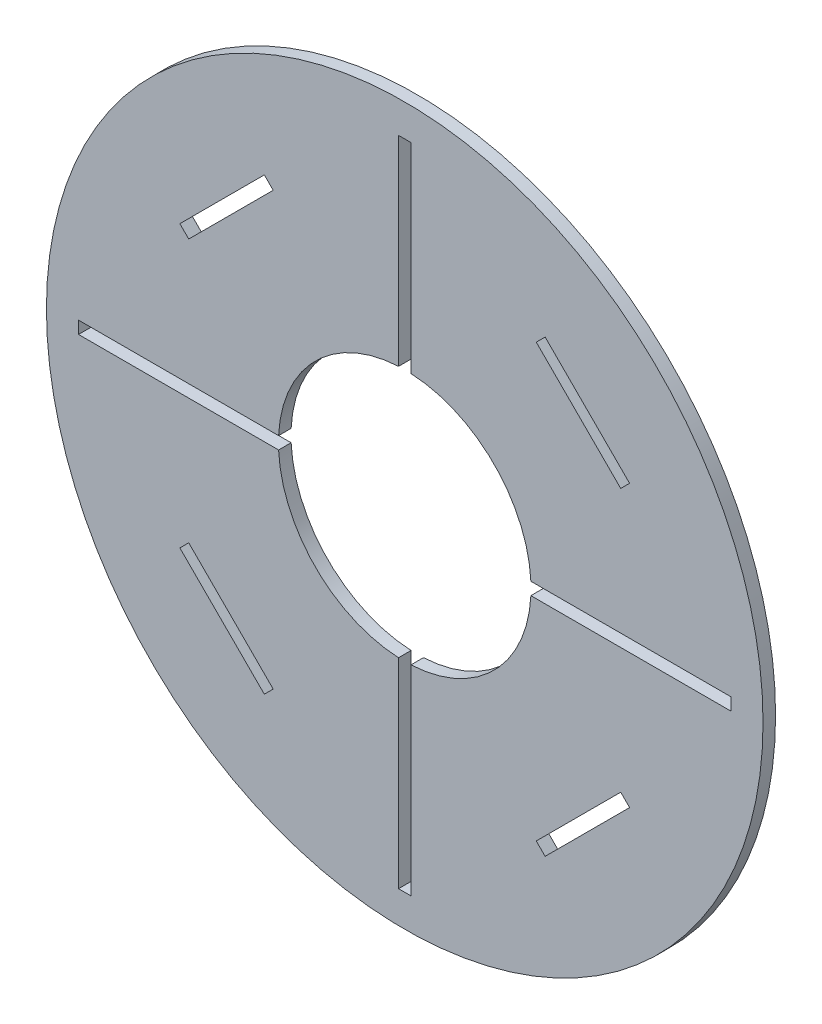
ISO-10303-21;
HEADER;
FILE_DESCRIPTION(('STEP AP214'),'2;1');
FILE_NAME('part.step','',(''),(''),'','','');
FILE_SCHEMA(('AUTOMOTIVE_DESIGN { 1 0 10303 214 1 1 1 1 }'));
ENDSEC;
DATA;
#1=APPLICATION_CONTEXT('core data for automotive mechanical design processes');
#2=APPLICATION_PROTOCOL_DEFINITION('international standard','automotive_design',2000,#1);
#3=PRODUCT_CONTEXT('',#1,'mechanical');
#4=PRODUCT('Part','Part','',(#3));
#5=PRODUCT_RELATED_PRODUCT_CATEGORY('part','',(#4));
#6=PRODUCT_DEFINITION_FORMATION('','',#4);
#7=PRODUCT_DEFINITION_CONTEXT('part definition',#1,'design');
#8=PRODUCT_DEFINITION('design','',#6,#7);
#9=PRODUCT_DEFINITION_SHAPE('','',#8);
#10=(LENGTH_UNIT() NAMED_UNIT(*) SI_UNIT(.MILLI.,.METRE.));
#11=(NAMED_UNIT(*) PLANE_ANGLE_UNIT() SI_UNIT($,.RADIAN.));
#12=(NAMED_UNIT(*) SI_UNIT($,.STERADIAN.) SOLID_ANGLE_UNIT());
#13=UNCERTAINTY_MEASURE_WITH_UNIT(LENGTH_MEASURE(1.E-05),#10,'distance_accuracy_value','');
#14=(GEOMETRIC_REPRESENTATION_CONTEXT(3) GLOBAL_UNCERTAINTY_ASSIGNED_CONTEXT((#13)) GLOBAL_UNIT_ASSIGNED_CONTEXT((#10,
#11,#12)) REPRESENTATION_CONTEXT('',''));
#15=CARTESIAN_POINT('',(0.,0.,0.));
#16=DIRECTION('',(0.,0.,1.));
#17=DIRECTION('',(1.,0.,0.));
#18=AXIS2_PLACEMENT_3D('',#15,#16,#17);
#19=CARTESIAN_POINT('',(0.,0.,5.334));
#20=DIRECTION('',(0.,0.,-1.));
#21=DIRECTION('',(-1.,0.,0.));
#22=AXIS2_PLACEMENT_3D('',#19,#20,#21);
#23=CYLINDRICAL_SURFACE('',#22,53.721);
#24=DIRECTION('',(0.,0.,1.));
#25=VECTOR('',#24,1.);
#26=CARTESIAN_POINT('',(-53.6560135533753,-2.64160000000019,-0.00100000000000013));
#27=LINE('',#26,#25);
#28=CARTESIAN_POINT('',(-53.6560135533753,-2.64160000000019,0.));
#29=VERTEX_POINT('',#28);
#30=CARTESIAN_POINT('',(-53.6560135533753,-2.64160000000019,5.334));
#31=VERTEX_POINT('',#30);
#32=EDGE_CURVE('E448',#29,#31,#27,.T.);
#33=ORIENTED_EDGE('',*,*,#32,.T.);
#34=CARTESIAN_POINT('',(0.,0.,5.334));
#35=DIRECTION('',(0.,0.,1.));
#36=DIRECTION('',(1.,0.,0.));
#37=AXIS2_PLACEMENT_3D('',#34,#35,#36);
#38=CIRCLE('',#37,53.721);
#39=CARTESIAN_POINT('',(-2.64160000000001,-53.6560135533754,5.334));
#40=VERTEX_POINT('',#39);
#41=EDGE_CURVE('E573',#31,#40,#38,.T.);
#42=ORIENTED_EDGE('',*,*,#41,.T.);
#43=DIRECTION('',(0.,0.,1.));
#44=VECTOR('',#43,1.);
#45=CARTESIAN_POINT('',(-2.64160000000001,-53.6560135533754,-0.00100000000000013));
#46=LINE('',#45,#44);
#47=CARTESIAN_POINT('',(-2.64160000000001,-53.6560135533754,0.));
#48=VERTEX_POINT('',#47);
#49=EDGE_CURVE('E484',#48,#40,#46,.T.);
#50=ORIENTED_EDGE('',*,*,#49,.F.);
#51=CARTESIAN_POINT('',(0.,0.,0.));
#52=DIRECTION('',(0.,0.,1.));
#53=DIRECTION('',(1.,0.,0.));
#54=AXIS2_PLACEMENT_3D('',#51,#52,#53);
#55=CIRCLE('',#54,53.721);
#56=EDGE_CURVE('E578',#29,#48,#55,.T.);
#57=ORIENTED_EDGE('',*,*,#56,.F.);
#58=EDGE_LOOP('',(#33,#42,#50,#57));
#59=FACE_BOUND('',#58,.T.);
#60=ADVANCED_FACE('F39',(#59),#23,.F.);
#61=DIRECTION('',(0.,0.,1.));
#62=VECTOR('',#61,1.);
#63=CARTESIAN_POINT('',(2.6416,-53.6560135533754,-0.00100000000000013));
#64=LINE('',#63,#62);
#65=CARTESIAN_POINT('',(2.6416,-53.6560135533754,0.));
#66=VERTEX_POINT('',#65);
#67=CARTESIAN_POINT('',(2.6416,-53.6560135533754,5.334));
#68=VERTEX_POINT('',#67);
#69=EDGE_CURVE('E485',#66,#68,#64,.T.);
#70=ORIENTED_EDGE('',*,*,#69,.T.);
#71=CARTESIAN_POINT('',(53.6560135533754,-2.64159999999944,5.334));
#72=VERTEX_POINT('',#71);
#73=EDGE_CURVE('E585',#68,#72,#38,.T.);
#74=ORIENTED_EDGE('',*,*,#73,.T.);
#75=DIRECTION('',(0.,0.,1.));
#76=VECTOR('',#75,1.);
#77=CARTESIAN_POINT('',(53.6560135533754,-2.64159999999944,-0.00100000000000013));
#78=LINE('',#77,#76);
#79=CARTESIAN_POINT('',(53.6560135533754,-2.64159999999944,0.));
#80=VERTEX_POINT('',#79);
#81=EDGE_CURVE('E517',#80,#72,#78,.T.);
#82=ORIENTED_EDGE('',*,*,#81,.F.);
#83=EDGE_CURVE('E587',#66,#80,#55,.T.);
#84=ORIENTED_EDGE('',*,*,#83,.F.);
#85=EDGE_LOOP('',(#70,#74,#82,#84));
#86=FACE_BOUND('',#85,.T.);
#87=ADVANCED_FACE('F602',(#86),#23,.F.);
#88=DIRECTION('',(0.,0.,1.));
#89=VECTOR('',#88,1.);
#90=CARTESIAN_POINT('',(53.6560135533753,2.64160000000057,-0.00100000000000013));
#91=LINE('',#90,#89);
#92=CARTESIAN_POINT('',(53.6560135533753,2.64160000000057,0.));
#93=VERTEX_POINT('',#92);
#94=CARTESIAN_POINT('',(53.6560135533753,2.64160000000057,5.334));
#95=VERTEX_POINT('',#94);
#96=EDGE_CURVE('E518',#93,#95,#91,.T.);
#97=ORIENTED_EDGE('',*,*,#96,.T.);
#98=CARTESIAN_POINT('',(2.64160000000001,53.6560135533754,5.334));
#99=VERTEX_POINT('',#98);
#100=EDGE_CURVE('E574',#95,#99,#38,.T.);
#101=ORIENTED_EDGE('',*,*,#100,.T.);
#102=DIRECTION('',(0.,0.,1.));
#103=VECTOR('',#102,1.);
#104=CARTESIAN_POINT('',(2.64160000000001,53.6560135533754,-0.00100000000000013));
#105=LINE('',#104,#103);
#106=CARTESIAN_POINT('',(2.64160000000001,53.6560135533754,0.));
#107=VERTEX_POINT('',#106);
#108=EDGE_CURVE('E550',#107,#99,#105,.T.);
#109=ORIENTED_EDGE('',*,*,#108,.F.);
#110=EDGE_CURVE('E568',#93,#107,#55,.T.);
#111=ORIENTED_EDGE('',*,*,#110,.F.);
#112=EDGE_LOOP('',(#97,#101,#109,#111));
#113=FACE_BOUND('',#112,.T.);
#114=ADVANCED_FACE('F621',(#113),#23,.F.);
#115=CARTESIAN_POINT('',(0.,0.,5.334));
#116=DIRECTION('',(0.,0.,1.));
#117=DIRECTION('',(1.,0.,0.));
#118=AXIS2_PLACEMENT_3D('',#115,#116,#117);
#119=PLANE('',#118);
#120=DIRECTION('',(0.707106781186544,0.707106781186551,0.));
#121=VECTOR('',#120,1.);
#122=CARTESIAN_POINT('',(-59.7187032051094,-95.6397276893868,5.334));
#123=LINE('',#122,#121);
#124=CARTESIAN_POINT('',(-59.7187032051094,-95.6397276893868,5.334));
#125=VERTEX_POINT('',#124);
#126=CARTESIAN_POINT('',(-55.9469956342604,-91.8680201185377,5.334));
#127=VERTEX_POINT('',#126);
#128=EDGE_CURVE('E55',#125,#127,#123,.T.);
#129=ORIENTED_EDGE('',*,*,#128,.F.);
#130=DIRECTION('',(0.70710678118655,-0.707106781186545,0.));
#131=VECTOR('',#130,1.);
#132=CARTESIAN_POINT('',(-59.7187032051094,-95.6397276893868,5.334));
#133=LINE('',#132,#131);
#134=CARTESIAN_POINT('',(-95.6397276893861,-59.7187032051103,5.334));
#135=VERTEX_POINT('',#134);
#136=EDGE_CURVE('E258',#135,#125,#133,.T.);
#137=ORIENTED_EDGE('',*,*,#136,.F.);
#138=DIRECTION('',(-0.707106781186546,-0.707106781186549,0.));
#139=VECTOR('',#138,1.);
#140=CARTESIAN_POINT('',(-91.8680201185371,-55.9469956342613,5.334));
#141=LINE('',#140,#139);
#142=CARTESIAN_POINT('',(-91.8680201185371,-55.9469956342613,5.334));
#143=VERTEX_POINT('',#142);
#144=EDGE_CURVE('E286',#143,#135,#141,.T.);
#145=ORIENTED_EDGE('',*,*,#144,.F.);
#146=DIRECTION('',(-0.70710678118655,0.707106781186545,0.));
#147=VECTOR('',#146,1.);
#148=CARTESIAN_POINT('',(-55.9469956342604,-91.8680201185377,5.334));
#149=LINE('',#148,#147);
#150=EDGE_CURVE('E278',#127,#143,#149,.T.);
#151=ORIENTED_EDGE('',*,*,#150,.F.);
#152=EDGE_LOOP('',(#129,#137,#145,#151));
#153=FACE_BOUND('',#152,.T.);
#154=DIRECTION('',(-0.707106781186549,0.707106781186546,0.));
#155=VECTOR('',#154,1.);
#156=CARTESIAN_POINT('',(95.6397276893866,-59.7187032051097,5.334));
#157=LINE('',#156,#155);
#158=CARTESIAN_POINT('',(95.6397276893866,-59.7187032051097,5.334));
#159=VERTEX_POINT('',#158);
#160=CARTESIAN_POINT('',(91.8680201185375,-55.9469956342607,5.334));
#161=VERTEX_POINT('',#160);
#162=EDGE_CURVE('E63',#159,#161,#157,.T.);
#163=ORIENTED_EDGE('',*,*,#162,.F.);
#164=DIRECTION('',(0.707106781186547,0.707106781186548,0.));
#165=VECTOR('',#164,1.);
#166=CARTESIAN_POINT('',(95.6397276893866,-59.7187032051097,5.334));
#167=LINE('',#166,#165);
#168=CARTESIAN_POINT('',(59.71870320511,-95.6397276893863,5.334));
#169=VERTEX_POINT('',#168);
#170=EDGE_CURVE('E322',#169,#159,#167,.T.);
#171=ORIENTED_EDGE('',*,*,#170,.F.);
#172=DIRECTION('',(0.707106781186546,-0.707106781186549,0.));
#173=VECTOR('',#172,1.);
#174=CARTESIAN_POINT('',(55.946995634261,-91.8680201185373,5.334));
#175=LINE('',#174,#173);
#176=CARTESIAN_POINT('',(55.946995634261,-91.8680201185373,5.334));
#177=VERTEX_POINT('',#176);
#178=EDGE_CURVE('E318',#177,#169,#175,.T.);
#179=ORIENTED_EDGE('',*,*,#178,.F.);
#180=DIRECTION('',(-0.707106781186547,-0.707106781186548,0.));
#181=VECTOR('',#180,1.);
#182=CARTESIAN_POINT('',(91.8680201185375,-55.9469956342607,5.334));
#183=LINE('',#182,#181);
#184=EDGE_CURVE('E314',#161,#177,#183,.T.);
#185=ORIENTED_EDGE('',*,*,#184,.F.);
#186=EDGE_LOOP('',(#163,#171,#179,#185));
#187=FACE_BOUND('',#186,.T.);
#188=DIRECTION('',(-0.707106781186539,-0.707106781186556,0.));
#189=VECTOR('',#188,1.);
#190=CARTESIAN_POINT('',(59.7187032051087,95.6397276893872,5.334));
#191=LINE('',#190,#189);
#192=CARTESIAN_POINT('',(59.7187032051087,95.6397276893872,5.334));
#193=VERTEX_POINT('',#192);
#194=CARTESIAN_POINT('',(55.9469956342597,91.8680201185381,5.334));
#195=VERTEX_POINT('',#194);
#196=EDGE_CURVE('E353',#193,#195,#191,.T.);
#197=ORIENTED_EDGE('',*,*,#196,.F.);
#198=DIRECTION('',(-0.707106781186555,0.70710678118654,0.));
#199=VECTOR('',#198,1.);
#200=CARTESIAN_POINT('',(59.7187032051087,95.6397276893872,5.334));
#201=LINE('',#200,#199);
#202=CARTESIAN_POINT('',(95.6397276893857,59.718703205111,5.334));
#203=VERTEX_POINT('',#202);
#204=EDGE_CURVE('E364',#203,#193,#201,.T.);
#205=ORIENTED_EDGE('',*,*,#204,.F.);
#206=DIRECTION('',(0.707106781186541,0.707106781186554,0.));
#207=VECTOR('',#206,1.);
#208=CARTESIAN_POINT('',(91.8680201185367,55.9469956342619,5.334));
#209=LINE('',#208,#207);
#210=CARTESIAN_POINT('',(91.8680201185367,55.9469956342619,5.334));
#211=VERTEX_POINT('',#210);
#212=EDGE_CURVE('E360',#211,#203,#209,.T.);
#213=ORIENTED_EDGE('',*,*,#212,.F.);
#214=DIRECTION('',(0.707106781186555,-0.70710678118654,0.));
#215=VECTOR('',#214,1.);
#216=CARTESIAN_POINT('',(55.9469956342597,91.8680201185381,5.334));
#217=LINE('',#216,#215);
#218=EDGE_CURVE('E356',#195,#211,#217,.T.);
#219=ORIENTED_EDGE('',*,*,#218,.F.);
#220=EDGE_LOOP('',(#197,#205,#213,#219));
#221=FACE_BOUND('',#220,.T.);
#222=DIRECTION('',(0.707106781186549,-0.707106781186546,0.));
#223=VECTOR('',#222,1.);
#224=CARTESIAN_POINT('',(-95.6397276893866,59.7187032051097,5.334));
#225=LINE('',#224,#223);
#226=CARTESIAN_POINT('',(-95.6397276893866,59.7187032051097,5.334));
#227=VERTEX_POINT('',#226);
#228=CARTESIAN_POINT('',(-91.8680201185375,55.9469956342607,5.334));
#229=VERTEX_POINT('',#228);
#230=EDGE_CURVE('E394',#227,#229,#225,.T.);
#231=ORIENTED_EDGE('',*,*,#230,.F.);
#232=DIRECTION('',(-0.707106781186547,-0.707106781186548,0.));
#233=VECTOR('',#232,1.);
#234=CARTESIAN_POINT('',(-95.6397276893866,59.7187032051097,5.334));
#235=LINE('',#234,#233);
#236=CARTESIAN_POINT('',(-59.71870320511,95.6397276893863,5.334));
#237=VERTEX_POINT('',#236);
#238=EDGE_CURVE('E405',#237,#227,#235,.T.);
#239=ORIENTED_EDGE('',*,*,#238,.F.);
#240=DIRECTION('',(-0.707106781186546,0.707106781186549,0.));
#241=VECTOR('',#240,1.);
#242=CARTESIAN_POINT('',(-55.946995634261,91.8680201185373,5.334));
#243=LINE('',#242,#241);
#244=CARTESIAN_POINT('',(-55.946995634261,91.8680201185373,5.334));
#245=VERTEX_POINT('',#244);
#246=EDGE_CURVE('E401',#245,#237,#243,.T.);
#247=ORIENTED_EDGE('',*,*,#246,.F.);
#248=DIRECTION('',(0.707106781186547,0.707106781186548,0.));
#249=VECTOR('',#248,1.);
#250=CARTESIAN_POINT('',(-91.8680201185375,55.9469956342607,5.334));
#251=LINE('',#250,#249);
#252=EDGE_CURVE('E397',#229,#245,#251,.T.);
#253=ORIENTED_EDGE('',*,*,#252,.F.);
#254=EDGE_LOOP('',(#231,#239,#247,#253));
#255=FACE_BOUND('',#254,.T.);
#256=DIRECTION('',(1.,0.,0.));
#257=VECTOR('',#256,1.);
#258=CARTESIAN_POINT('',(-53.6560135533753,-2.64160000000019,5.334));
#259=LINE('',#258,#257);
#260=CARTESIAN_POINT('',(-138.746013553375,-2.64160000000049,5.334));
#261=VERTEX_POINT('',#260);
#262=EDGE_CURVE('E444',#261,#31,#259,.T.);
#263=ORIENTED_EDGE('',*,*,#262,.F.);
#264=DIRECTION('',(0.,-1.,0.));
#265=VECTOR('',#264,1.);
#266=CARTESIAN_POINT('',(-138.746013553375,-2.64160000000049,5.334));
#267=LINE('',#266,#265);
#268=CARTESIAN_POINT('',(-138.746013553375,2.64159999999951,5.334));
#269=VERTEX_POINT('',#268);
#270=EDGE_CURVE('E440',#269,#261,#267,.T.);
#271=ORIENTED_EDGE('',*,*,#270,.F.);
#272=DIRECTION('',(-1.,0.,0.));
#273=VECTOR('',#272,1.);
#274=CARTESIAN_POINT('',(-138.746013553375,2.64159999999951,5.334));
#275=LINE('',#274,#273);
#276=CARTESIAN_POINT('',(-53.6560135533754,2.64159999999982,5.334));
#277=VERTEX_POINT('',#276);
#278=EDGE_CURVE('E436',#277,#269,#275,.T.);
#279=ORIENTED_EDGE('',*,*,#278,.F.);
#280=CARTESIAN_POINT('',(-2.6416,53.6560135533754,5.334));
#281=VERTEX_POINT('',#280);
#282=EDGE_CURVE('E569',#281,#277,#38,.T.);
#283=ORIENTED_EDGE('',*,*,#282,.F.);
#284=DIRECTION('',(0.,-1.,0.));
#285=VECTOR('',#284,1.);
#286=CARTESIAN_POINT('',(-2.6416,53.6560135533754,5.334));
#287=LINE('',#286,#285);
#288=CARTESIAN_POINT('',(-2.6416,138.746013553375,5.334));
#289=VERTEX_POINT('',#288);
#290=EDGE_CURVE('E547',#289,#281,#287,.T.);
#291=ORIENTED_EDGE('',*,*,#290,.F.);
#292=DIRECTION('',(-1.,0.,0.));
#293=VECTOR('',#292,1.);
#294=CARTESIAN_POINT('',(-2.6416,138.746013553375,5.334));
#295=LINE('',#294,#293);
#296=CARTESIAN_POINT('',(2.64159999999999,138.746013553375,5.334));
#297=VERTEX_POINT('',#296);
#298=EDGE_CURVE('E543',#297,#289,#295,.T.);
#299=ORIENTED_EDGE('',*,*,#298,.F.);
#300=DIRECTION('',(0.,1.,0.));
#301=VECTOR('',#300,1.);
#302=CARTESIAN_POINT('',(2.64159999999999,138.746013553375,5.334));
#303=LINE('',#302,#301);
#304=EDGE_CURVE('E539',#99,#297,#303,.T.);
#305=ORIENTED_EDGE('',*,*,#304,.F.);
#306=ORIENTED_EDGE('',*,*,#100,.F.);
#307=DIRECTION('',(-1.,0.,0.));
#308=VECTOR('',#307,1.);
#309=CARTESIAN_POINT('',(53.6560135533753,2.64160000000057,5.334));
#310=LINE('',#309,#308);
#311=CARTESIAN_POINT('',(138.746013553375,2.64160000000146,5.334));
#312=VERTEX_POINT('',#311);
#313=EDGE_CURVE('E514',#312,#95,#310,.T.);
#314=ORIENTED_EDGE('',*,*,#313,.F.);
#315=DIRECTION('',(0.,1.,0.));
#316=VECTOR('',#315,1.);
#317=CARTESIAN_POINT('',(138.746013553375,2.64160000000146,5.334));
#318=LINE('',#317,#316);
#319=CARTESIAN_POINT('',(138.746013553375,-2.64159999999854,5.334));
#320=VERTEX_POINT('',#319);
#321=EDGE_CURVE('E510',#320,#312,#318,.T.);
#322=ORIENTED_EDGE('',*,*,#321,.F.);
#323=DIRECTION('',(1.,0.,0.));
#324=VECTOR('',#323,1.);
#325=CARTESIAN_POINT('',(138.746013553375,-2.64159999999854,5.334));
#326=LINE('',#325,#324);
#327=EDGE_CURVE('E506',#72,#320,#326,.T.);
#328=ORIENTED_EDGE('',*,*,#327,.F.);
#329=ORIENTED_EDGE('',*,*,#73,.F.);
#330=DIRECTION('',(0.,1.,0.));
#331=VECTOR('',#330,1.);
#332=CARTESIAN_POINT('',(2.6416,-53.6560135533754,5.334));
#333=LINE('',#332,#331);
#334=CARTESIAN_POINT('',(2.6416,-138.746013553375,5.334));
#335=VERTEX_POINT('',#334);
#336=EDGE_CURVE('E481',#335,#68,#333,.T.);
#337=ORIENTED_EDGE('',*,*,#336,.F.);
#338=DIRECTION('',(1.,0.,0.));
#339=VECTOR('',#338,1.);
#340=CARTESIAN_POINT('',(2.6416,-138.746013553375,5.334));
#341=LINE('',#340,#339);
#342=CARTESIAN_POINT('',(-2.64159999999999,-138.746013553375,5.334));
#343=VERTEX_POINT('',#342);
#344=EDGE_CURVE('E477',#343,#335,#341,.T.);
#345=ORIENTED_EDGE('',*,*,#344,.F.);
#346=DIRECTION('',(0.,-1.,0.));
#347=VECTOR('',#346,1.);
#348=CARTESIAN_POINT('',(-2.64159999999999,-138.746013553375,5.334));
#349=LINE('',#348,#347);
#350=EDGE_CURVE('E473',#40,#343,#349,.T.);
#351=ORIENTED_EDGE('',*,*,#350,.F.);
#352=ORIENTED_EDGE('',*,*,#41,.F.);
#353=EDGE_LOOP('',(#263,#271,#279,#283,#291,#299,#305,#306,#314,#322,#328,#329,#337,#345,#351,#352));
#354=FACE_BOUND('',#353,.T.);
#355=CARTESIAN_POINT('',(0.,0.,5.334));
#356=DIRECTION('',(0.,0.,1.));
#357=DIRECTION('',(1.,0.,0.));
#358=AXIS2_PLACEMENT_3D('',#355,#356,#357);
#359=CIRCLE('',#358,152.4);
#360=CARTESIAN_POINT('',(152.4,0.,5.334));
#361=VERTEX_POINT('',#360);
#362=EDGE_CURVE('E11',#361,#361,#359,.T.);
#363=ORIENTED_EDGE('',*,*,#362,.T.);
#364=EDGE_LOOP('',(#363));
#365=FACE_BOUND('',#364,.T.);
#366=ADVANCED_FACE('F611',(#153,#187,#221,#255,#354,#365),#119,.T.);
#367=CARTESIAN_POINT('',(0.,0.,0.));
#368=DIRECTION('',(0.,0.,1.));
#369=DIRECTION('',(1.,0.,0.));
#370=AXIS2_PLACEMENT_3D('',#367,#368,#369);
#371=PLANE('',#370);
#372=DIRECTION('',(-0.70710678118655,0.707106781186545,0.));
#373=VECTOR('',#372,1.);
#374=CARTESIAN_POINT('',(-59.7187032051094,-95.6397276893868,0.));
#375=LINE('',#374,#373);
#376=CARTESIAN_POINT('',(-59.7187032051094,-95.6397276893868,0.));
#377=VERTEX_POINT('',#376);
#378=CARTESIAN_POINT('',(-95.6397276893861,-59.7187032051103,0.));
#379=VERTEX_POINT('',#378);
#380=EDGE_CURVE('E273',#377,#379,#375,.T.);
#381=ORIENTED_EDGE('',*,*,#380,.F.);
#382=DIRECTION('',(-0.707106781186544,-0.707106781186551,0.));
#383=VECTOR('',#382,1.);
#384=CARTESIAN_POINT('',(-59.7187032051094,-95.6397276893868,0.));
#385=LINE('',#384,#383);
#386=CARTESIAN_POINT('',(-55.9469956342604,-91.8680201185377,0.));
#387=VERTEX_POINT('',#386);
#388=EDGE_CURVE('E251',#387,#377,#385,.T.);
#389=ORIENTED_EDGE('',*,*,#388,.F.);
#390=DIRECTION('',(0.70710678118655,-0.707106781186545,0.));
#391=VECTOR('',#390,1.);
#392=CARTESIAN_POINT('',(-55.9469956342604,-91.8680201185377,0.));
#393=LINE('',#392,#391);
#394=CARTESIAN_POINT('',(-91.8680201185371,-55.9469956342613,0.));
#395=VERTEX_POINT('',#394);
#396=EDGE_CURVE('E262',#395,#387,#393,.T.);
#397=ORIENTED_EDGE('',*,*,#396,.F.);
#398=DIRECTION('',(0.707106781186546,0.707106781186549,0.));
#399=VECTOR('',#398,1.);
#400=CARTESIAN_POINT('',(-91.8680201185371,-55.9469956342613,0.));
#401=LINE('',#400,#399);
#402=EDGE_CURVE('E280',#379,#395,#401,.T.);
#403=ORIENTED_EDGE('',*,*,#402,.F.);
#404=EDGE_LOOP('',(#381,#389,#397,#403));
#405=FACE_BOUND('',#404,.T.);
#406=DIRECTION('',(-0.707106781186547,-0.707106781186548,0.));
#407=VECTOR('',#406,1.);
#408=CARTESIAN_POINT('',(95.6397276893866,-59.7187032051097,0.));
#409=LINE('',#408,#407);
#410=CARTESIAN_POINT('',(95.6397276893866,-59.7187032051097,0.));
#411=VERTEX_POINT('',#410);
#412=CARTESIAN_POINT('',(59.71870320511,-95.6397276893863,0.));
#413=VERTEX_POINT('',#412);
#414=EDGE_CURVE('E303',#411,#413,#409,.T.);
#415=ORIENTED_EDGE('',*,*,#414,.F.);
#416=DIRECTION('',(0.707106781186549,-0.707106781186546,0.));
#417=VECTOR('',#416,1.);
#418=CARTESIAN_POINT('',(95.6397276893866,-59.7187032051097,0.));
#419=LINE('',#418,#417);
#420=CARTESIAN_POINT('',(91.8680201185375,-55.9469956342607,0.));
#421=VERTEX_POINT('',#420);
#422=EDGE_CURVE('E308',#421,#411,#419,.T.);
#423=ORIENTED_EDGE('',*,*,#422,.F.);
#424=DIRECTION('',(0.707106781186547,0.707106781186548,0.));
#425=VECTOR('',#424,1.);
#426=CARTESIAN_POINT('',(91.8680201185375,-55.9469956342607,0.));
#427=LINE('',#426,#425);
#428=CARTESIAN_POINT('',(55.946995634261,-91.8680201185373,0.));
#429=VERTEX_POINT('',#428);
#430=EDGE_CURVE('E330',#429,#421,#427,.T.);
#431=ORIENTED_EDGE('',*,*,#430,.F.);
#432=DIRECTION('',(-0.707106781186546,0.707106781186549,0.));
#433=VECTOR('',#432,1.);
#434=CARTESIAN_POINT('',(55.946995634261,-91.8680201185373,0.));
#435=LINE('',#434,#433);
#436=EDGE_CURVE('E300',#413,#429,#435,.T.);
#437=ORIENTED_EDGE('',*,*,#436,.F.);
#438=EDGE_LOOP('',(#415,#423,#431,#437));
#439=FACE_BOUND('',#438,.T.);
#440=DIRECTION('',(0.707106781186555,-0.70710678118654,0.));
#441=VECTOR('',#440,1.);
#442=CARTESIAN_POINT('',(59.7187032051087,95.6397276893872,0.));
#443=LINE('',#442,#441);
#444=CARTESIAN_POINT('',(59.7187032051087,95.6397276893872,0.));
#445=VERTEX_POINT('',#444);
#446=CARTESIAN_POINT('',(95.6397276893857,59.718703205111,0.));
#447=VERTEX_POINT('',#446);
#448=EDGE_CURVE('E345',#445,#447,#443,.T.);
#449=ORIENTED_EDGE('',*,*,#448,.F.);
#450=DIRECTION('',(0.707106781186539,0.707106781186556,0.));
#451=VECTOR('',#450,1.);
#452=CARTESIAN_POINT('',(59.7187032051087,95.6397276893872,0.));
#453=LINE('',#452,#451);
#454=CARTESIAN_POINT('',(55.9469956342597,91.8680201185381,0.));
#455=VERTEX_POINT('',#454);
#456=EDGE_CURVE('E349',#455,#445,#453,.T.);
#457=ORIENTED_EDGE('',*,*,#456,.F.);
#458=DIRECTION('',(-0.707106781186555,0.70710678118654,0.));
#459=VECTOR('',#458,1.);
#460=CARTESIAN_POINT('',(55.9469956342597,91.8680201185381,0.));
#461=LINE('',#460,#459);
#462=CARTESIAN_POINT('',(91.8680201185367,55.9469956342619,0.));
#463=VERTEX_POINT('',#462);
#464=EDGE_CURVE('E304',#463,#455,#461,.T.);
#465=ORIENTED_EDGE('',*,*,#464,.F.);
#466=DIRECTION('',(-0.707106781186541,-0.707106781186554,0.));
#467=VECTOR('',#466,1.);
#468=CARTESIAN_POINT('',(91.8680201185367,55.9469956342619,0.));
#469=LINE('',#468,#467);
#470=EDGE_CURVE('E342',#447,#463,#469,.T.);
#471=ORIENTED_EDGE('',*,*,#470,.F.);
#472=EDGE_LOOP('',(#449,#457,#465,#471));
#473=FACE_BOUND('',#472,.T.);
#474=DIRECTION('',(0.707106781186547,0.707106781186548,0.));
#475=VECTOR('',#474,1.);
#476=CARTESIAN_POINT('',(-95.6397276893866,59.7187032051097,0.));
#477=LINE('',#476,#475);
#478=CARTESIAN_POINT('',(-95.6397276893866,59.7187032051097,0.));
#479=VERTEX_POINT('',#478);
#480=CARTESIAN_POINT('',(-59.71870320511,95.6397276893863,0.));
#481=VERTEX_POINT('',#480);
#482=EDGE_CURVE('E386',#479,#481,#477,.T.);
#483=ORIENTED_EDGE('',*,*,#482,.F.);
#484=DIRECTION('',(-0.707106781186549,0.707106781186546,0.));
#485=VECTOR('',#484,1.);
#486=CARTESIAN_POINT('',(-95.6397276893866,59.7187032051097,0.));
#487=LINE('',#486,#485);
#488=CARTESIAN_POINT('',(-91.8680201185375,55.9469956342607,0.));
#489=VERTEX_POINT('',#488);
#490=EDGE_CURVE('E390',#489,#479,#487,.T.);
#491=ORIENTED_EDGE('',*,*,#490,.F.);
#492=DIRECTION('',(-0.707106781186547,-0.707106781186548,0.));
#493=VECTOR('',#492,1.);
#494=CARTESIAN_POINT('',(-91.8680201185375,55.9469956342607,0.));
#495=LINE('',#494,#493);
#496=CARTESIAN_POINT('',(-55.946995634261,91.8680201185373,0.));
#497=VERTEX_POINT('',#496);
#498=EDGE_CURVE('E413',#497,#489,#495,.T.);
#499=ORIENTED_EDGE('',*,*,#498,.F.);
#500=DIRECTION('',(0.707106781186546,-0.707106781186549,0.));
#501=VECTOR('',#500,1.);
#502=CARTESIAN_POINT('',(-55.946995634261,91.8680201185373,0.));
#503=LINE('',#502,#501);
#504=EDGE_CURVE('E267',#481,#497,#503,.T.);
#505=ORIENTED_EDGE('',*,*,#504,.F.);
#506=EDGE_LOOP('',(#483,#491,#499,#505));
#507=FACE_BOUND('',#506,.T.);
#508=CARTESIAN_POINT('',(0.,0.,0.));
#509=DIRECTION('',(0.,0.,1.));
#510=DIRECTION('',(1.,0.,0.));
#511=AXIS2_PLACEMENT_3D('',#508,#509,#510);
#512=CIRCLE('',#511,152.4);
#513=CARTESIAN_POINT('',(152.4,0.,0.));
#514=VERTEX_POINT('',#513);
#515=EDGE_CURVE('E43',#514,#514,#512,.T.);
#516=ORIENTED_EDGE('',*,*,#515,.F.);
#517=EDGE_LOOP('',(#516));
#518=FACE_BOUND('',#517,.T.);
#519=DIRECTION('',(0.,1.,0.));
#520=VECTOR('',#519,1.);
#521=CARTESIAN_POINT('',(-138.746013553375,-2.64160000000049,0.));
#522=LINE('',#521,#520);
#523=CARTESIAN_POINT('',(-138.746013553375,-2.64160000000049,0.));
#524=VERTEX_POINT('',#523);
#525=CARTESIAN_POINT('',(-138.746013553375,2.64159999999951,0.));
#526=VERTEX_POINT('',#525);
#527=EDGE_CURVE('E427',#524,#526,#522,.T.);
#528=ORIENTED_EDGE('',*,*,#527,.F.);
#529=DIRECTION('',(-1.,0.,0.));
#530=VECTOR('',#529,1.);
#531=CARTESIAN_POINT('',(-53.6560135533753,-2.64160000000019,0.));
#532=LINE('',#531,#530);
#533=EDGE_CURVE('E431',#29,#524,#532,.T.);
#534=ORIENTED_EDGE('',*,*,#533,.F.);
#535=ORIENTED_EDGE('',*,*,#56,.T.);
#536=DIRECTION('',(0.,1.,0.));
#537=VECTOR('',#536,1.);
#538=CARTESIAN_POINT('',(-2.64159999999999,-138.746013553375,0.));
#539=LINE('',#538,#537);
#540=CARTESIAN_POINT('',(-2.64159999999999,-138.746013553375,0.));
#541=VERTEX_POINT('',#540);
#542=EDGE_CURVE('E432',#541,#48,#539,.T.);
#543=ORIENTED_EDGE('',*,*,#542,.F.);
#544=DIRECTION('',(-1.,0.,0.));
#545=VECTOR('',#544,1.);
#546=CARTESIAN_POINT('',(2.6416,-138.746013553375,0.));
#547=LINE('',#546,#545);
#548=CARTESIAN_POINT('',(2.6416,-138.746013553375,0.));
#549=VERTEX_POINT('',#548);
#550=EDGE_CURVE('E464',#549,#541,#547,.T.);
#551=ORIENTED_EDGE('',*,*,#550,.F.);
#552=DIRECTION('',(0.,-1.,0.));
#553=VECTOR('',#552,1.);
#554=CARTESIAN_POINT('',(2.6416,-53.6560135533754,0.));
#555=LINE('',#554,#553);
#556=EDGE_CURVE('E468',#66,#549,#555,.T.);
#557=ORIENTED_EDGE('',*,*,#556,.F.);
#558=ORIENTED_EDGE('',*,*,#83,.T.);
#559=DIRECTION('',(-1.,0.,0.));
#560=VECTOR('',#559,1.);
#561=CARTESIAN_POINT('',(138.746013553375,-2.64159999999854,0.));
#562=LINE('',#561,#560);
#563=CARTESIAN_POINT('',(138.746013553375,-2.64159999999854,0.));
#564=VERTEX_POINT('',#563);
#565=EDGE_CURVE('E469',#564,#80,#562,.T.);
#566=ORIENTED_EDGE('',*,*,#565,.F.);
#567=DIRECTION('',(0.,-1.,0.));
#568=VECTOR('',#567,1.);
#569=CARTESIAN_POINT('',(138.746013553375,2.64160000000146,0.));
#570=LINE('',#569,#568);
#571=CARTESIAN_POINT('',(138.746013553375,2.64160000000146,0.));
#572=VERTEX_POINT('',#571);
#573=EDGE_CURVE('E426',#572,#564,#570,.T.);
#574=ORIENTED_EDGE('',*,*,#573,.F.);
#575=DIRECTION('',(1.,0.,0.));
#576=VECTOR('',#575,1.);
#577=CARTESIAN_POINT('',(53.6560135533753,2.64160000000057,0.));
#578=LINE('',#577,#576);
#579=EDGE_CURVE('E502',#93,#572,#578,.T.);
#580=ORIENTED_EDGE('',*,*,#579,.F.);
#581=ORIENTED_EDGE('',*,*,#110,.T.);
#582=DIRECTION('',(0.,-1.,0.));
#583=VECTOR('',#582,1.);
#584=CARTESIAN_POINT('',(2.64159999999999,138.746013553375,0.));
#585=LINE('',#584,#583);
#586=CARTESIAN_POINT('',(2.64159999999999,138.746013553375,0.));
#587=VERTEX_POINT('',#586);
#588=EDGE_CURVE('E555',#587,#107,#585,.T.);
#589=ORIENTED_EDGE('',*,*,#588,.F.);
#590=DIRECTION('',(1.,0.,0.));
#591=VECTOR('',#590,1.);
#592=CARTESIAN_POINT('',(-2.6416,138.746013553375,0.));
#593=LINE('',#592,#591);
#594=CARTESIAN_POINT('',(-2.6416,138.746013553375,0.));
#595=VERTEX_POINT('',#594);
#596=EDGE_CURVE('E463',#595,#587,#593,.T.);
#597=ORIENTED_EDGE('',*,*,#596,.F.);
#598=DIRECTION('',(0.,1.,0.));
#599=VECTOR('',#598,1.);
#600=CARTESIAN_POINT('',(-2.6416,53.6560135533754,0.));
#601=LINE('',#600,#599);
#602=CARTESIAN_POINT('',(-2.6416,53.6560135533754,0.));
#603=VERTEX_POINT('',#602);
#604=EDGE_CURVE('E535',#603,#595,#601,.T.);
#605=ORIENTED_EDGE('',*,*,#604,.F.);
#606=CARTESIAN_POINT('',(-53.6560135533754,2.64159999999982,0.));
#607=VERTEX_POINT('',#606);
#608=EDGE_CURVE('E575',#603,#607,#55,.T.);
#609=ORIENTED_EDGE('',*,*,#608,.T.);
#610=DIRECTION('',(1.,0.,0.));
#611=VECTOR('',#610,1.);
#612=CARTESIAN_POINT('',(-138.746013553375,2.64159999999951,0.));
#613=LINE('',#612,#611);
#614=EDGE_CURVE('E452',#526,#607,#613,.T.);
#615=ORIENTED_EDGE('',*,*,#614,.F.);
#616=EDGE_LOOP('',(#528,#534,#535,#543,#551,#557,#558,#566,#574,#580,#581,#589,#597,#605,#609,#615));
#617=FACE_BOUND('',#616,.T.);
#618=ADVANCED_FACE('F270',(#405,#439,#473,#507,#518,#617),#371,.F.);
#619=CARTESIAN_POINT('',(0.,0.,5.334));
#620=DIRECTION('',(0.,0.,-1.));
#621=DIRECTION('',(-1.,0.,0.));
#622=AXIS2_PLACEMENT_3D('',#619,#620,#621);
#623=CYLINDRICAL_SURFACE('',#622,152.4);
#624=ORIENTED_EDGE('',*,*,#362,.F.);
#625=EDGE_LOOP('',(#624));
#626=FACE_BOUND('',#625,.T.);
#627=ORIENTED_EDGE('',*,*,#515,.T.);
#628=EDGE_LOOP('',(#627));
#629=FACE_BOUND('',#628,.T.);
#630=ADVANCED_FACE('F41',(#626,#629),#623,.T.);
#631=DIRECTION('',(0.,0.,1.));
#632=VECTOR('',#631,1.);
#633=CARTESIAN_POINT('',(-53.6560135533754,2.64159999999982,-0.00100000000000013));
#634=LINE('',#633,#632);
#635=EDGE_CURVE('E447',#607,#277,#634,.T.);
#636=ORIENTED_EDGE('',*,*,#635,.F.);
#637=ORIENTED_EDGE('',*,*,#608,.F.);
#638=DIRECTION('',(0.,0.,1.));
#639=VECTOR('',#638,1.);
#640=CARTESIAN_POINT('',(-2.6416,53.6560135533754,-0.00100000000000013));
#641=LINE('',#640,#639);
#642=EDGE_CURVE('E551',#603,#281,#641,.T.);
#643=ORIENTED_EDGE('',*,*,#642,.T.);
#644=ORIENTED_EDGE('',*,*,#282,.T.);
#645=EDGE_LOOP('',(#636,#637,#643,#644));
#646=FACE_BOUND('',#645,.T.);
#647=ADVANCED_FACE('F634',(#646),#23,.F.);
#648=CARTESIAN_POINT('',(-2.6416,53.6560135533754,-0.00100000000000013));
#649=DIRECTION('',(-1.,0.,0.));
#650=DIRECTION('',(0.,0.,1.));
#651=AXIS2_PLACEMENT_3D('',#648,#649,#650);
#652=PLANE('',#651);
#653=ORIENTED_EDGE('',*,*,#604,.T.);
#654=DIRECTION('',(0.,0.,1.));
#655=VECTOR('',#654,1.);
#656=CARTESIAN_POINT('',(-2.6416,138.746013553375,-0.00100000000000013));
#657=LINE('',#656,#655);
#658=EDGE_CURVE('E556',#595,#289,#657,.T.);
#659=ORIENTED_EDGE('',*,*,#658,.T.);
#660=ORIENTED_EDGE('',*,*,#290,.T.);
#661=ORIENTED_EDGE('',*,*,#642,.F.);
#662=EDGE_LOOP('',(#653,#659,#660,#661));
#663=FACE_BOUND('',#662,.T.);
#664=ADVANCED_FACE('F674',(#663),#652,.F.);
#665=CARTESIAN_POINT('',(-2.6416,138.746013553375,-0.00100000000000013));
#666=DIRECTION('',(0.,1.,0.));
#667=DIRECTION('',(0.,0.,1.));
#668=AXIS2_PLACEMENT_3D('',#665,#666,#667);
#669=PLANE('',#668);
#670=ORIENTED_EDGE('',*,*,#596,.T.);
#671=DIRECTION('',(0.,0.,1.));
#672=VECTOR('',#671,1.);
#673=CARTESIAN_POINT('',(2.64159999999999,138.746013553375,-0.00100000000000013));
#674=LINE('',#673,#672);
#675=EDGE_CURVE('E559',#587,#297,#674,.T.);
#676=ORIENTED_EDGE('',*,*,#675,.T.);
#677=ORIENTED_EDGE('',*,*,#298,.T.);
#678=ORIENTED_EDGE('',*,*,#658,.F.);
#679=EDGE_LOOP('',(#670,#676,#677,#678));
#680=FACE_BOUND('',#679,.T.);
#681=ADVANCED_FACE('F629',(#680),#669,.F.);
#682=CARTESIAN_POINT('',(2.64159999999999,138.746013553375,-0.00100000000000013));
#683=DIRECTION('',(1.,0.,0.));
#684=DIRECTION('',(0.,1.,0.));
#685=AXIS2_PLACEMENT_3D('',#682,#683,#684);
#686=PLANE('',#685);
#687=ORIENTED_EDGE('',*,*,#588,.T.);
#688=ORIENTED_EDGE('',*,*,#108,.T.);
#689=ORIENTED_EDGE('',*,*,#304,.T.);
#690=ORIENTED_EDGE('',*,*,#675,.F.);
#691=EDGE_LOOP('',(#687,#688,#689,#690));
#692=FACE_BOUND('',#691,.T.);
#693=ADVANCED_FACE('F624',(#692),#686,.F.);
#694=CARTESIAN_POINT('',(53.6560135533753,2.64160000000057,-0.00100000000000013));
#695=DIRECTION('',(0.,1.,0.));
#696=DIRECTION('',(-1.,0.,0.));
#697=AXIS2_PLACEMENT_3D('',#694,#695,#696);
#698=PLANE('',#697);
#699=ORIENTED_EDGE('',*,*,#579,.T.);
#700=DIRECTION('',(0.,0.,1.));
#701=VECTOR('',#700,1.);
#702=CARTESIAN_POINT('',(138.746013553375,2.64160000000146,-0.00100000000000013));
#703=LINE('',#702,#701);
#704=EDGE_CURVE('E522',#572,#312,#703,.T.);
#705=ORIENTED_EDGE('',*,*,#704,.T.);
#706=ORIENTED_EDGE('',*,*,#313,.T.);
#707=ORIENTED_EDGE('',*,*,#96,.F.);
#708=EDGE_LOOP('',(#699,#705,#706,#707));
#709=FACE_BOUND('',#708,.T.);
#710=ADVANCED_FACE('F924',(#709),#698,.F.);
#711=CARTESIAN_POINT('',(138.746013553375,2.64160000000146,-0.00100000000000013));
#712=DIRECTION('',(1.,0.,0.));
#713=DIRECTION('',(0.,1.,0.));
#714=AXIS2_PLACEMENT_3D('',#711,#712,#713);
#715=PLANE('',#714);
#716=ORIENTED_EDGE('',*,*,#573,.T.);
#717=DIRECTION('',(0.,0.,1.));
#718=VECTOR('',#717,1.);
#719=CARTESIAN_POINT('',(138.746013553375,-2.64159999999854,-0.00100000000000013));
#720=LINE('',#719,#718);
#721=EDGE_CURVE('E525',#564,#320,#720,.T.);
#722=ORIENTED_EDGE('',*,*,#721,.T.);
#723=ORIENTED_EDGE('',*,*,#321,.T.);
#724=ORIENTED_EDGE('',*,*,#704,.F.);
#725=EDGE_LOOP('',(#716,#722,#723,#724));
#726=FACE_BOUND('',#725,.T.);
#727=ADVANCED_FACE('F617',(#726),#715,.F.);
#728=CARTESIAN_POINT('',(138.746013553375,-2.64159999999854,-0.00100000000000013));
#729=DIRECTION('',(0.,-1.,0.));
#730=DIRECTION('',(1.,0.,0.));
#731=AXIS2_PLACEMENT_3D('',#728,#729,#730);
#732=PLANE('',#731);
#733=ORIENTED_EDGE('',*,*,#565,.T.);
#734=ORIENTED_EDGE('',*,*,#81,.T.);
#735=ORIENTED_EDGE('',*,*,#327,.T.);
#736=ORIENTED_EDGE('',*,*,#721,.F.);
#737=EDGE_LOOP('',(#733,#734,#735,#736));
#738=FACE_BOUND('',#737,.T.);
#739=ADVANCED_FACE('F607',(#738),#732,.F.);
#740=CARTESIAN_POINT('',(2.6416,-53.6560135533754,-0.00100000000000013));
#741=DIRECTION('',(1.,0.,0.));
#742=DIRECTION('',(0.,0.,-1.));
#743=AXIS2_PLACEMENT_3D('',#740,#741,#742);
#744=PLANE('',#743);
#745=ORIENTED_EDGE('',*,*,#556,.T.);
#746=DIRECTION('',(0.,0.,1.));
#747=VECTOR('',#746,1.);
#748=CARTESIAN_POINT('',(2.6416,-138.746013553375,-0.00100000000000013));
#749=LINE('',#748,#747);
#750=EDGE_CURVE('E489',#549,#335,#749,.T.);
#751=ORIENTED_EDGE('',*,*,#750,.T.);
#752=ORIENTED_EDGE('',*,*,#336,.T.);
#753=ORIENTED_EDGE('',*,*,#69,.F.);
#754=EDGE_LOOP('',(#745,#751,#752,#753));
#755=FACE_BOUND('',#754,.T.);
#756=ADVANCED_FACE('F656',(#755),#744,.F.);
#757=CARTESIAN_POINT('',(2.6416,-138.746013553375,-0.00100000000000013));
#758=DIRECTION('',(0.,-1.,0.));
#759=DIRECTION('',(0.,0.,-1.));
#760=AXIS2_PLACEMENT_3D('',#757,#758,#759);
#761=PLANE('',#760);
#762=ORIENTED_EDGE('',*,*,#550,.T.);
#763=DIRECTION('',(0.,0.,1.));
#764=VECTOR('',#763,1.);
#765=CARTESIAN_POINT('',(-2.64159999999999,-138.746013553375,-0.00100000000000013));
#766=LINE('',#765,#764);
#767=EDGE_CURVE('E492',#541,#343,#766,.T.);
#768=ORIENTED_EDGE('',*,*,#767,.T.);
#769=ORIENTED_EDGE('',*,*,#344,.T.);
#770=ORIENTED_EDGE('',*,*,#750,.F.);
#771=EDGE_LOOP('',(#762,#768,#769,#770));
#772=FACE_BOUND('',#771,.T.);
#773=ADVANCED_FACE('F654',(#772),#761,.F.);
#774=CARTESIAN_POINT('',(-2.64159999999999,-138.746013553375,-0.00100000000000013));
#775=DIRECTION('',(-1.,0.,0.));
#776=DIRECTION('',(0.,-1.,0.));
#777=AXIS2_PLACEMENT_3D('',#774,#775,#776);
#778=PLANE('',#777);
#779=ORIENTED_EDGE('',*,*,#542,.T.);
#780=ORIENTED_EDGE('',*,*,#49,.T.);
#781=ORIENTED_EDGE('',*,*,#350,.T.);
#782=ORIENTED_EDGE('',*,*,#767,.F.);
#783=EDGE_LOOP('',(#779,#780,#781,#782));
#784=FACE_BOUND('',#783,.T.);
#785=ADVANCED_FACE('F651',(#784),#778,.F.);
#786=CARTESIAN_POINT('',(-53.6560135533753,-2.64160000000019,-0.00100000000000013));
#787=DIRECTION('',(0.,-1.,0.));
#788=DIRECTION('',(1.,0.,0.));
#789=AXIS2_PLACEMENT_3D('',#786,#787,#788);
#790=PLANE('',#789);
#791=ORIENTED_EDGE('',*,*,#533,.T.);
#792=DIRECTION('',(0.,0.,1.));
#793=VECTOR('',#792,1.);
#794=CARTESIAN_POINT('',(-138.746013553375,-2.64160000000049,-0.00100000000000013));
#795=LINE('',#794,#793);
#796=EDGE_CURVE('E453',#524,#261,#795,.T.);
#797=ORIENTED_EDGE('',*,*,#796,.T.);
#798=ORIENTED_EDGE('',*,*,#262,.T.);
#799=ORIENTED_EDGE('',*,*,#32,.F.);
#800=EDGE_LOOP('',(#791,#797,#798,#799));
#801=FACE_BOUND('',#800,.T.);
#802=ADVANCED_FACE('F730',(#801),#790,.F.);
#803=CARTESIAN_POINT('',(-138.746013553375,-2.64160000000049,-0.00100000000000013));
#804=DIRECTION('',(-1.,0.,0.));
#805=DIRECTION('',(0.,-1.,0.));
#806=AXIS2_PLACEMENT_3D('',#803,#804,#805);
#807=PLANE('',#806);
#808=ORIENTED_EDGE('',*,*,#527,.T.);
#809=DIRECTION('',(0.,0.,1.));
#810=VECTOR('',#809,1.);
#811=CARTESIAN_POINT('',(-138.746013553375,2.64159999999951,-0.00100000000000013));
#812=LINE('',#811,#810);
#813=EDGE_CURVE('E456',#526,#269,#812,.T.);
#814=ORIENTED_EDGE('',*,*,#813,.T.);
#815=ORIENTED_EDGE('',*,*,#270,.T.);
#816=ORIENTED_EDGE('',*,*,#796,.F.);
#817=EDGE_LOOP('',(#808,#814,#815,#816));
#818=FACE_BOUND('',#817,.T.);
#819=ADVANCED_FACE('F641',(#818),#807,.F.);
#820=CARTESIAN_POINT('',(-138.746013553375,2.64159999999951,-0.00100000000000013));
#821=DIRECTION('',(0.,1.,0.));
#822=DIRECTION('',(-1.,0.,0.));
#823=AXIS2_PLACEMENT_3D('',#820,#821,#822);
#824=PLANE('',#823);
#825=ORIENTED_EDGE('',*,*,#614,.T.);
#826=ORIENTED_EDGE('',*,*,#635,.T.);
#827=ORIENTED_EDGE('',*,*,#278,.T.);
#828=ORIENTED_EDGE('',*,*,#813,.F.);
#829=EDGE_LOOP('',(#825,#826,#827,#828));
#830=FACE_BOUND('',#829,.T.);
#831=ADVANCED_FACE('F637',(#830),#824,.F.);
#832=CARTESIAN_POINT('',(-95.6397276893866,59.7187032051097,-0.00100000000000013));
#833=DIRECTION('',(-0.707106781186546,-0.707106781186549,0.));
#834=DIRECTION('',(0.707106781186549,-0.707106781186546,0.));
#835=AXIS2_PLACEMENT_3D('',#832,#833,#834);
#836=PLANE('',#835);
#837=ORIENTED_EDGE('',*,*,#490,.T.);
#838=DIRECTION('',(0.,0.,1.));
#839=VECTOR('',#838,1.);
#840=CARTESIAN_POINT('',(-95.6397276893866,59.7187032051097,-0.00100000000000013));
#841=LINE('',#840,#839);
#842=EDGE_CURVE('E410',#479,#227,#841,.T.);
#843=ORIENTED_EDGE('',*,*,#842,.T.);
#844=ORIENTED_EDGE('',*,*,#230,.T.);
#845=DIRECTION('',(0.,0.,1.));
#846=VECTOR('',#845,1.);
#847=CARTESIAN_POINT('',(-91.8680201185375,55.9469956342607,-0.00100000000000013));
#848=LINE('',#847,#846);
#849=EDGE_CURVE('E409',#489,#229,#848,.T.);
#850=ORIENTED_EDGE('',*,*,#849,.F.);
#851=EDGE_LOOP('',(#837,#843,#844,#850));
#852=FACE_BOUND('',#851,.T.);
#853=ADVANCED_FACE('F703',(#852),#836,.F.);
#854=CARTESIAN_POINT('',(-95.6397276893866,59.7187032051097,-0.00100000000000013));
#855=DIRECTION('',(-0.707106781186548,0.707106781186547,0.));
#856=DIRECTION('',(-0.707106781186547,-0.707106781186548,0.));
#857=AXIS2_PLACEMENT_3D('',#854,#855,#856);
#858=PLANE('',#857);
#859=ORIENTED_EDGE('',*,*,#482,.T.);
#860=DIRECTION('',(0.,0.,1.));
#861=VECTOR('',#860,1.);
#862=CARTESIAN_POINT('',(-59.71870320511,95.6397276893863,-0.00100000000000013));
#863=LINE('',#862,#861);
#864=EDGE_CURVE('E414',#481,#237,#863,.T.);
#865=ORIENTED_EDGE('',*,*,#864,.T.);
#866=ORIENTED_EDGE('',*,*,#238,.T.);
#867=ORIENTED_EDGE('',*,*,#842,.F.);
#868=EDGE_LOOP('',(#859,#865,#866,#867));
#869=FACE_BOUND('',#868,.T.);
#870=ADVANCED_FACE('F714',(#869),#858,.F.);
#871=CARTESIAN_POINT('',(-55.946995634261,91.8680201185373,-0.00100000000000013));
#872=DIRECTION('',(0.707106781186549,0.707106781186546,0.));
#873=DIRECTION('',(-0.707106781186546,0.707106781186549,0.));
#874=AXIS2_PLACEMENT_3D('',#871,#872,#873);
#875=PLANE('',#874);
#876=ORIENTED_EDGE('',*,*,#504,.T.);
#877=DIRECTION('',(0.,0.,1.));
#878=VECTOR('',#877,1.);
#879=CARTESIAN_POINT('',(-55.946995634261,91.8680201185373,-0.00100000000000013));
#880=LINE('',#879,#878);
#881=EDGE_CURVE('E417',#497,#245,#880,.T.);
#882=ORIENTED_EDGE('',*,*,#881,.T.);
#883=ORIENTED_EDGE('',*,*,#246,.T.);
#884=ORIENTED_EDGE('',*,*,#864,.F.);
#885=EDGE_LOOP('',(#876,#882,#883,#884));
#886=FACE_BOUND('',#885,.T.);
#887=ADVANCED_FACE('F716',(#886),#875,.F.);
#888=CARTESIAN_POINT('',(-91.8680201185375,55.9469956342607,-0.00100000000000013));
#889=DIRECTION('',(0.707106781186548,-0.707106781186547,0.));
#890=DIRECTION('',(0.707106781186547,0.707106781186548,0.));
#891=AXIS2_PLACEMENT_3D('',#888,#889,#890);
#892=PLANE('',#891);
#893=ORIENTED_EDGE('',*,*,#498,.T.);
#894=ORIENTED_EDGE('',*,*,#849,.T.);
#895=ORIENTED_EDGE('',*,*,#252,.T.);
#896=ORIENTED_EDGE('',*,*,#881,.F.);
#897=EDGE_LOOP('',(#893,#894,#895,#896));
#898=FACE_BOUND('',#897,.T.);
#899=ADVANCED_FACE('F705',(#898),#892,.F.);
#900=CARTESIAN_POINT('',(59.7187032051087,95.6397276893872,-0.00100000000000013));
#901=DIRECTION('',(-0.707106781186556,0.707106781186539,0.));
#902=DIRECTION('',(-0.707106781186539,-0.707106781186556,0.));
#903=AXIS2_PLACEMENT_3D('',#900,#901,#902);
#904=PLANE('',#903);
#905=ORIENTED_EDGE('',*,*,#456,.T.);
#906=DIRECTION('',(0.,0.,1.));
#907=VECTOR('',#906,1.);
#908=CARTESIAN_POINT('',(59.7187032051087,95.6397276893872,-0.00100000000000013));
#909=LINE('',#908,#907);
#910=EDGE_CURVE('E369',#445,#193,#909,.T.);
#911=ORIENTED_EDGE('',*,*,#910,.T.);
#912=ORIENTED_EDGE('',*,*,#196,.T.);
#913=DIRECTION('',(0.,0.,1.));
#914=VECTOR('',#913,1.);
#915=CARTESIAN_POINT('',(55.9469956342597,91.8680201185381,-0.00100000000000013));
#916=LINE('',#915,#914);
#917=EDGE_CURVE('E368',#455,#195,#916,.T.);
#918=ORIENTED_EDGE('',*,*,#917,.F.);
#919=EDGE_LOOP('',(#905,#911,#912,#918));
#920=FACE_BOUND('',#919,.T.);
#921=ADVANCED_FACE('F723',(#920),#904,.F.);
#922=CARTESIAN_POINT('',(59.7187032051087,95.6397276893872,-0.00100000000000013));
#923=DIRECTION('',(0.70710678118654,0.707106781186555,0.));
#924=DIRECTION('',(-0.707106781186555,0.70710678118654,0.));
#925=AXIS2_PLACEMENT_3D('',#922,#923,#924);
#926=PLANE('',#925);
#927=ORIENTED_EDGE('',*,*,#448,.T.);
#928=DIRECTION('',(0.,0.,1.));
#929=VECTOR('',#928,1.);
#930=CARTESIAN_POINT('',(95.6397276893857,59.718703205111,-0.00100000000000013));
#931=LINE('',#930,#929);
#932=EDGE_CURVE('E372',#447,#203,#931,.T.);
#933=ORIENTED_EDGE('',*,*,#932,.T.);
#934=ORIENTED_EDGE('',*,*,#204,.T.);
#935=ORIENTED_EDGE('',*,*,#910,.F.);
#936=EDGE_LOOP('',(#927,#933,#934,#935));
#937=FACE_BOUND('',#936,.T.);
#938=ADVANCED_FACE('F777',(#937),#926,.F.);
#939=CARTESIAN_POINT('',(91.8680201185367,55.9469956342619,-0.00100000000000013));
#940=DIRECTION('',(0.707106781186554,-0.707106781186541,0.));
#941=DIRECTION('',(0.707106781186541,0.707106781186554,0.));
#942=AXIS2_PLACEMENT_3D('',#939,#940,#941);
#943=PLANE('',#942);
#944=ORIENTED_EDGE('',*,*,#470,.T.);
#945=DIRECTION('',(0.,0.,1.));
#946=VECTOR('',#945,1.);
#947=CARTESIAN_POINT('',(91.8680201185367,55.9469956342619,-0.00100000000000013));
#948=LINE('',#947,#946);
#949=EDGE_CURVE('E375',#463,#211,#948,.T.);
#950=ORIENTED_EDGE('',*,*,#949,.T.);
#951=ORIENTED_EDGE('',*,*,#212,.T.);
#952=ORIENTED_EDGE('',*,*,#932,.F.);
#953=EDGE_LOOP('',(#944,#950,#951,#952));
#954=FACE_BOUND('',#953,.T.);
#955=ADVANCED_FACE('F786',(#954),#943,.F.);
#956=CARTESIAN_POINT('',(55.9469956342597,91.8680201185381,-0.00100000000000013));
#957=DIRECTION('',(-0.70710678118654,-0.707106781186555,0.));
#958=DIRECTION('',(0.707106781186555,-0.70710678118654,0.));
#959=AXIS2_PLACEMENT_3D('',#956,#957,#958);
#960=PLANE('',#959);
#961=ORIENTED_EDGE('',*,*,#464,.T.);
#962=ORIENTED_EDGE('',*,*,#917,.T.);
#963=ORIENTED_EDGE('',*,*,#218,.T.);
#964=ORIENTED_EDGE('',*,*,#949,.F.);
#965=EDGE_LOOP('',(#961,#962,#963,#964));
#966=FACE_BOUND('',#965,.T.);
#967=ADVANCED_FACE('F796',(#966),#960,.F.);
#968=CARTESIAN_POINT('',(95.6397276893866,-59.7187032051097,-0.00100000000000013));
#969=DIRECTION('',(0.707106781186546,0.707106781186549,0.));
#970=DIRECTION('',(-0.707106781186549,0.707106781186546,0.));
#971=AXIS2_PLACEMENT_3D('',#968,#969,#970);
#972=PLANE('',#971);
#973=ORIENTED_EDGE('',*,*,#422,.T.);
#974=DIRECTION('',(0.,0.,1.));
#975=VECTOR('',#974,1.);
#976=CARTESIAN_POINT('',(95.6397276893866,-59.7187032051097,-0.00100000000000013));
#977=LINE('',#976,#975);
#978=EDGE_CURVE('E327',#411,#159,#977,.T.);
#979=ORIENTED_EDGE('',*,*,#978,.T.);
#980=ORIENTED_EDGE('',*,*,#162,.T.);
#981=DIRECTION('',(0.,0.,1.));
#982=VECTOR('',#981,1.);
#983=CARTESIAN_POINT('',(91.8680201185375,-55.9469956342607,-0.00100000000000013));
#984=LINE('',#983,#982);
#985=EDGE_CURVE('E326',#421,#161,#984,.T.);
#986=ORIENTED_EDGE('',*,*,#985,.F.);
#987=EDGE_LOOP('',(#973,#979,#980,#986));
#988=FACE_BOUND('',#987,.T.);
#989=ADVANCED_FACE('F806',(#988),#972,.F.);
#990=CARTESIAN_POINT('',(95.6397276893866,-59.7187032051097,-0.00100000000000013));
#991=DIRECTION('',(0.707106781186548,-0.707106781186547,0.));
#992=DIRECTION('',(0.707106781186547,0.707106781186548,0.));
#993=AXIS2_PLACEMENT_3D('',#990,#991,#992);
#994=PLANE('',#993);
#995=ORIENTED_EDGE('',*,*,#414,.T.);
#996=DIRECTION('',(0.,0.,1.));
#997=VECTOR('',#996,1.);
#998=CARTESIAN_POINT('',(59.71870320511,-95.6397276893863,-0.00100000000000013));
#999=LINE('',#998,#997);
#1000=EDGE_CURVE('E331',#413,#169,#999,.T.);
#1001=ORIENTED_EDGE('',*,*,#1000,.T.);
#1002=ORIENTED_EDGE('',*,*,#170,.T.);
#1003=ORIENTED_EDGE('',*,*,#978,.F.);
#1004=EDGE_LOOP('',(#995,#1001,#1002,#1003));
#1005=FACE_BOUND('',#1004,.T.);
#1006=ADVANCED_FACE('F816',(#1005),#994,.F.);
#1007=CARTESIAN_POINT('',(55.946995634261,-91.8680201185373,-0.00100000000000013));
#1008=DIRECTION('',(-0.707106781186549,-0.707106781186546,0.));
#1009=DIRECTION('',(0.707106781186546,-0.707106781186549,0.));
#1010=AXIS2_PLACEMENT_3D('',#1007,#1008,#1009);
#1011=PLANE('',#1010);
#1012=ORIENTED_EDGE('',*,*,#436,.T.);
#1013=DIRECTION('',(0.,0.,1.));
#1014=VECTOR('',#1013,1.);
#1015=CARTESIAN_POINT('',(55.946995634261,-91.8680201185373,-0.00100000000000013));
#1016=LINE('',#1015,#1014);
#1017=EDGE_CURVE('E334',#429,#177,#1016,.T.);
#1018=ORIENTED_EDGE('',*,*,#1017,.T.);
#1019=ORIENTED_EDGE('',*,*,#178,.T.);
#1020=ORIENTED_EDGE('',*,*,#1000,.F.);
#1021=EDGE_LOOP('',(#1012,#1018,#1019,#1020));
#1022=FACE_BOUND('',#1021,.T.);
#1023=ADVANCED_FACE('F825',(#1022),#1011,.F.);
#1024=CARTESIAN_POINT('',(91.8680201185375,-55.9469956342607,-0.00100000000000013));
#1025=DIRECTION('',(-0.707106781186548,0.707106781186547,0.));
#1026=DIRECTION('',(-0.707106781186547,-0.707106781186548,0.));
#1027=AXIS2_PLACEMENT_3D('',#1024,#1025,#1026);
#1028=PLANE('',#1027);
#1029=ORIENTED_EDGE('',*,*,#430,.T.);
#1030=ORIENTED_EDGE('',*,*,#985,.T.);
#1031=ORIENTED_EDGE('',*,*,#184,.T.);
#1032=ORIENTED_EDGE('',*,*,#1017,.F.);
#1033=EDGE_LOOP('',(#1029,#1030,#1031,#1032));
#1034=FACE_BOUND('',#1033,.T.);
#1035=ADVANCED_FACE('F835',(#1034),#1028,.F.);
#1036=CARTESIAN_POINT('',(-59.7187032051094,-95.6397276893868,-0.00100000000000013));
#1037=DIRECTION('',(0.707106781186551,-0.707106781186544,0.));
#1038=DIRECTION('',(0.707106781186544,0.707106781186551,0.));
#1039=AXIS2_PLACEMENT_3D('',#1036,#1037,#1038);
#1040=PLANE('',#1039);
#1041=ORIENTED_EDGE('',*,*,#388,.T.);
#1042=DIRECTION('',(0.,0.,1.));
#1043=VECTOR('',#1042,1.);
#1044=CARTESIAN_POINT('',(-59.7187032051094,-95.6397276893868,-0.00100000000000013));
#1045=LINE('',#1044,#1043);
#1046=EDGE_CURVE('E268',#377,#125,#1045,.T.);
#1047=ORIENTED_EDGE('',*,*,#1046,.T.);
#1048=ORIENTED_EDGE('',*,*,#128,.T.);
#1049=DIRECTION('',(0.,0.,1.));
#1050=VECTOR('',#1049,1.);
#1051=CARTESIAN_POINT('',(-55.9469956342604,-91.8680201185377,-0.00100000000000013));
#1052=LINE('',#1051,#1050);
#1053=EDGE_CURVE('E247',#387,#127,#1052,.T.);
#1054=ORIENTED_EDGE('',*,*,#1053,.F.);
#1055=EDGE_LOOP('',(#1041,#1047,#1048,#1054));
#1056=FACE_BOUND('',#1055,.T.);
#1057=ADVANCED_FACE('F249',(#1056),#1040,.F.);
#1058=CARTESIAN_POINT('',(-59.7187032051094,-95.6397276893868,-0.00100000000000013));
#1059=DIRECTION('',(-0.707106781186545,-0.70710678118655,0.));
#1060=DIRECTION('',(0.70710678118655,-0.707106781186545,0.));
#1061=AXIS2_PLACEMENT_3D('',#1058,#1059,#1060);
#1062=PLANE('',#1061);
#1063=ORIENTED_EDGE('',*,*,#380,.T.);
#1064=DIRECTION('',(0.,0.,1.));
#1065=VECTOR('',#1064,1.);
#1066=CARTESIAN_POINT('',(-95.6397276893861,-59.7187032051103,-0.00100000000000013));
#1067=LINE('',#1066,#1065);
#1068=EDGE_CURVE('E295',#379,#135,#1067,.T.);
#1069=ORIENTED_EDGE('',*,*,#1068,.T.);
#1070=ORIENTED_EDGE('',*,*,#136,.T.);
#1071=ORIENTED_EDGE('',*,*,#1046,.F.);
#1072=EDGE_LOOP('',(#1063,#1069,#1070,#1071));
#1073=FACE_BOUND('',#1072,.T.);
#1074=ADVANCED_FACE('F854',(#1073),#1062,.F.);
#1075=CARTESIAN_POINT('',(-91.8680201185371,-55.9469956342613,-0.00100000000000013));
#1076=DIRECTION('',(-0.707106781186549,0.707106781186546,0.));
#1077=DIRECTION('',(-0.707106781186546,-0.707106781186549,0.));
#1078=AXIS2_PLACEMENT_3D('',#1075,#1076,#1077);
#1079=PLANE('',#1078);
#1080=ORIENTED_EDGE('',*,*,#402,.T.);
#1081=DIRECTION('',(0.,0.,1.));
#1082=VECTOR('',#1081,1.);
#1083=CARTESIAN_POINT('',(-91.8680201185371,-55.9469956342613,-0.00100000000000013));
#1084=LINE('',#1083,#1082);
#1085=EDGE_CURVE('E257',#395,#143,#1084,.T.);
#1086=ORIENTED_EDGE('',*,*,#1085,.T.);
#1087=ORIENTED_EDGE('',*,*,#144,.T.);
#1088=ORIENTED_EDGE('',*,*,#1068,.F.);
#1089=EDGE_LOOP('',(#1080,#1086,#1087,#1088));
#1090=FACE_BOUND('',#1089,.T.);
#1091=ADVANCED_FACE('F863',(#1090),#1079,.F.);
#1092=CARTESIAN_POINT('',(-55.9469956342604,-91.8680201185377,-0.00100000000000013));
#1093=DIRECTION('',(0.707106781186545,0.70710678118655,0.));
#1094=DIRECTION('',(-0.70710678118655,0.707106781186545,0.));
#1095=AXIS2_PLACEMENT_3D('',#1092,#1093,#1094);
#1096=PLANE('',#1095);
#1097=ORIENTED_EDGE('',*,*,#396,.T.);
#1098=ORIENTED_EDGE('',*,*,#1053,.T.);
#1099=ORIENTED_EDGE('',*,*,#150,.T.);
#1100=ORIENTED_EDGE('',*,*,#1085,.F.);
#1101=EDGE_LOOP('',(#1097,#1098,#1099,#1100));
#1102=FACE_BOUND('',#1101,.T.);
#1103=ADVANCED_FACE('F263',(#1102),#1096,.F.);
#1104=CLOSED_SHELL('',(#60,#87,#114,#366,#618,#630,#647,#664,#681,#693,#710,#727,#739,#756,#773,
#785,#802,#819,#831,#853,#870,#887,#899,#921,#938,#955,#967,#989,#1006,#1023,#1035,#1057,#1074,
#1091,#1103));
#1105=MANIFOLD_SOLID_BREP('B2',#1104);
#1106=ADVANCED_BREP_SHAPE_REPRESENTATION('',(#18,#1105),#14);
#1107=SHAPE_DEFINITION_REPRESENTATION(#9,#1106);
ENDSEC;
END-ISO-10303-21;
